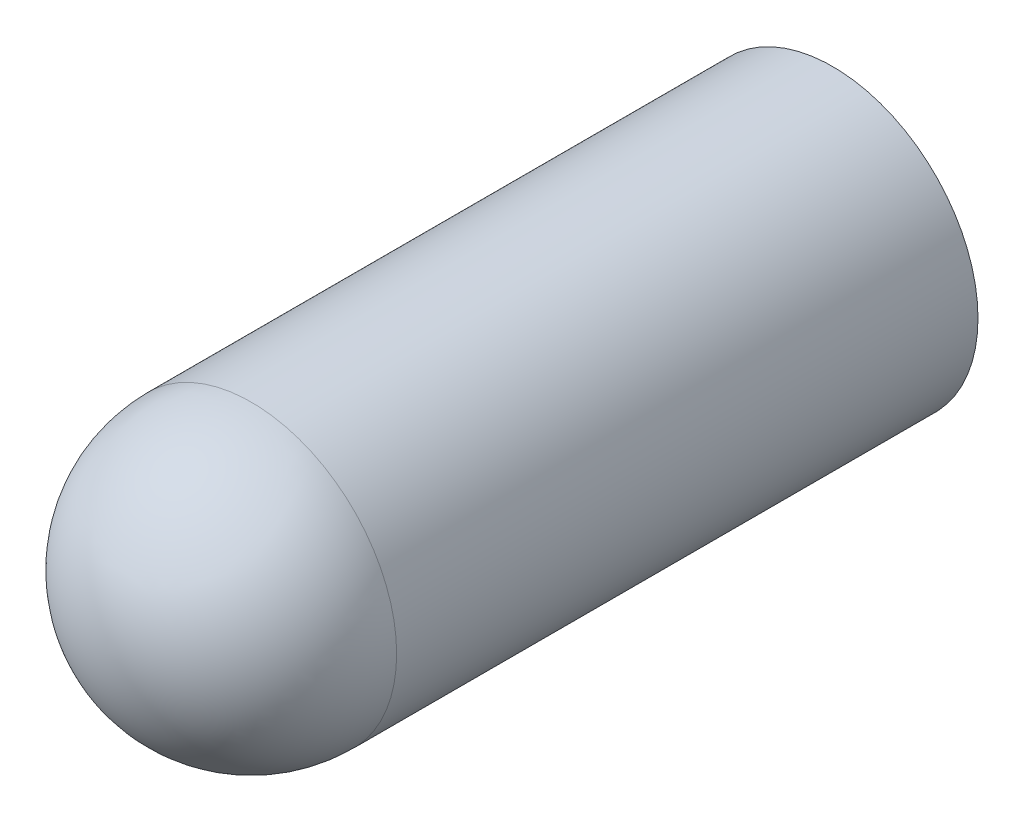
ISO-10303-21;
HEADER;
FILE_DESCRIPTION(('STEP AP214'),'2;1');
FILE_NAME('part.step','',(''),(''),'','','');
FILE_SCHEMA(('AUTOMOTIVE_DESIGN { 1 0 10303 214 1 1 1 1 }'));
ENDSEC;
DATA;
#1=APPLICATION_CONTEXT('core data for automotive mechanical design processes');
#2=APPLICATION_PROTOCOL_DEFINITION('international standard','automotive_design',2000,#1);
#3=PRODUCT_CONTEXT('',#1,'mechanical');
#4=PRODUCT('Part','Part','',(#3));
#5=PRODUCT_RELATED_PRODUCT_CATEGORY('part','',(#4));
#6=PRODUCT_DEFINITION_FORMATION('','',#4);
#7=PRODUCT_DEFINITION_CONTEXT('part definition',#1,'design');
#8=PRODUCT_DEFINITION('design','',#6,#7);
#9=PRODUCT_DEFINITION_SHAPE('','',#8);
#10=(LENGTH_UNIT() NAMED_UNIT(*) SI_UNIT(.MILLI.,.METRE.));
#11=(NAMED_UNIT(*) PLANE_ANGLE_UNIT() SI_UNIT($,.RADIAN.));
#12=(NAMED_UNIT(*) SI_UNIT($,.STERADIAN.) SOLID_ANGLE_UNIT());
#13=UNCERTAINTY_MEASURE_WITH_UNIT(LENGTH_MEASURE(1.E-05),#10,'distance_accuracy_value','');
#14=(GEOMETRIC_REPRESENTATION_CONTEXT(3) GLOBAL_UNCERTAINTY_ASSIGNED_CONTEXT((#13)) GLOBAL_UNIT_ASSIGNED_CONTEXT((#10,
#11,#12)) REPRESENTATION_CONTEXT('',''));
#15=CARTESIAN_POINT('',(0.,0.,0.));
#16=DIRECTION('',(0.,0.,1.));
#17=DIRECTION('',(1.,0.,0.));
#18=AXIS2_PLACEMENT_3D('',#15,#16,#17);
#19=CARTESIAN_POINT('',(0.,0.,5.));
#20=DIRECTION('',(0.,0.,-1.));
#21=DIRECTION('',(-1.,0.,0.));
#22=AXIS2_PLACEMENT_3D('',#19,#20,#21);
#23=CYLINDRICAL_SURFACE('',#22,1.);
#24=CARTESIAN_POINT('',(0.,0.,4.));
#25=DIRECTION('',(0.,0.,-1.));
#26=DIRECTION('',(-1.,0.,0.));
#27=AXIS2_PLACEMENT_3D('',#24,#25,#26);
#28=CIRCLE('',#27,1.);
#29=CARTESIAN_POINT('',(-1.,0.,4.));
#30=VERTEX_POINT('',#29);
#31=EDGE_CURVE('E10',#30,#30,#28,.T.);
#32=ORIENTED_EDGE('',*,*,#31,.T.);
#33=EDGE_LOOP('',(#32));
#34=FACE_BOUND('',#33,.T.);
#35=CARTESIAN_POINT('',(0.,0.,0.));
#36=DIRECTION('',(0.,0.,1.));
#37=DIRECTION('',(1.,0.,0.));
#38=AXIS2_PLACEMENT_3D('',#35,#36,#37);
#39=CIRCLE('',#38,1.);
#40=CARTESIAN_POINT('',(1.,0.,0.));
#41=VERTEX_POINT('',#40);
#42=EDGE_CURVE('E38',#41,#41,#39,.T.);
#43=ORIENTED_EDGE('',*,*,#42,.T.);
#44=EDGE_LOOP('',(#43));
#45=FACE_BOUND('',#44,.T.);
#46=ADVANCED_FACE('F31',(#34,#45),#23,.T.);
#47=CARTESIAN_POINT('',(0.,0.,0.));
#48=DIRECTION('',(0.,0.,1.));
#49=DIRECTION('',(1.,0.,0.));
#50=AXIS2_PLACEMENT_3D('',#47,#48,#49);
#51=PLANE('',#50);
#52=ORIENTED_EDGE('',*,*,#42,.F.);
#53=EDGE_LOOP('',(#52));
#54=FACE_BOUND('',#53,.T.);
#55=ADVANCED_FACE('F45',(#54),#51,.F.);
#56=CARTESIAN_POINT('',(0.,0.,4.));
#57=DIRECTION('',(0.,0.,1.));
#58=DIRECTION('',(1.,0.,0.));
#59=AXIS2_PLACEMENT_3D('',#56,#57,#58);
#60=SPHERICAL_SURFACE('',#59,1.);
#61=ORIENTED_EDGE('',*,*,#31,.F.);
#62=EDGE_LOOP('',(#61));
#63=FACE_BOUND('',#62,.T.);
#64=ADVANCED_FACE('F33',(#63),#60,.T.);
#65=CLOSED_SHELL('',(#46,#55,#64));
#66=MANIFOLD_SOLID_BREP('B2',#65);
#67=ADVANCED_BREP_SHAPE_REPRESENTATION('',(#18,#66),#14);
#68=SHAPE_DEFINITION_REPRESENTATION(#9,#67);
ENDSEC;
END-ISO-10303-21;
